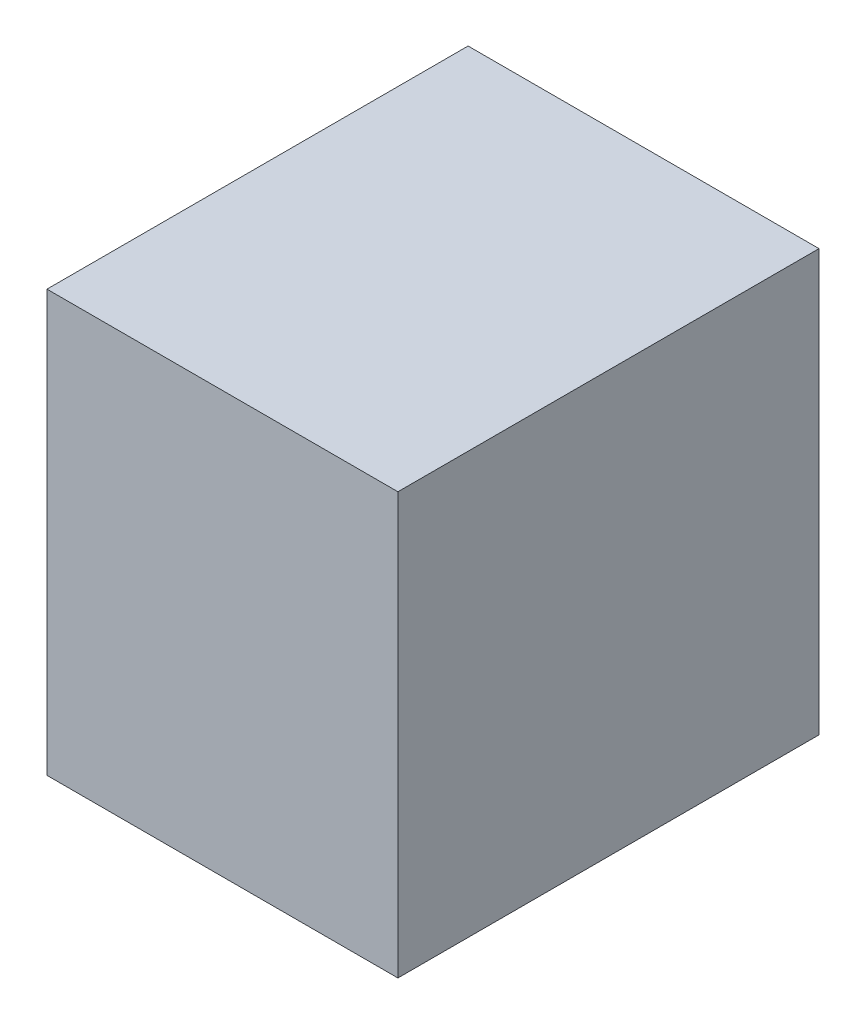
ISO-10303-21;
HEADER;
FILE_DESCRIPTION(('STEP AP214'),'2;1');
FILE_NAME('part.step','',(''),(''),'','','');
FILE_SCHEMA(('AUTOMOTIVE_DESIGN { 1 0 10303 214 1 1 1 1 }'));
ENDSEC;
DATA;
#1=APPLICATION_CONTEXT('core data for automotive mechanical design processes');
#2=APPLICATION_PROTOCOL_DEFINITION('international standard','automotive_design',2000,#1);
#3=PRODUCT_CONTEXT('',#1,'mechanical');
#4=PRODUCT('Part','Part','',(#3));
#5=PRODUCT_RELATED_PRODUCT_CATEGORY('part','',(#4));
#6=PRODUCT_DEFINITION_FORMATION('','',#4);
#7=PRODUCT_DEFINITION_CONTEXT('part definition',#1,'design');
#8=PRODUCT_DEFINITION('design','',#6,#7);
#9=PRODUCT_DEFINITION_SHAPE('','',#8);
#10=(LENGTH_UNIT() NAMED_UNIT(*) SI_UNIT(.MILLI.,.METRE.));
#11=(NAMED_UNIT(*) PLANE_ANGLE_UNIT() SI_UNIT($,.RADIAN.));
#12=(NAMED_UNIT(*) SI_UNIT($,.STERADIAN.) SOLID_ANGLE_UNIT());
#13=UNCERTAINTY_MEASURE_WITH_UNIT(LENGTH_MEASURE(1.E-05),#10,'distance_accuracy_value','');
#14=(GEOMETRIC_REPRESENTATION_CONTEXT(3) GLOBAL_UNCERTAINTY_ASSIGNED_CONTEXT((#13)) GLOBAL_UNIT_ASSIGNED_CONTEXT((#10,
#11,#12)) REPRESENTATION_CONTEXT('',''));
#15=CARTESIAN_POINT('',(0.,0.,0.));
#16=DIRECTION('',(0.,0.,1.));
#17=DIRECTION('',(1.,0.,0.));
#18=AXIS2_PLACEMENT_3D('',#15,#16,#17);
#19=CARTESIAN_POINT('',(44.0503208682354,37.6310916584124,30.));
#20=DIRECTION('',(1.,0.,0.));
#21=DIRECTION('',(0.,0.,-1.));
#22=AXIS2_PLACEMENT_3D('',#19,#20,#21);
#23=PLANE('',#22);
#24=DIRECTION('',(0.,-1.,0.));
#25=VECTOR('',#24,1.);
#26=CARTESIAN_POINT('',(44.0503208682354,37.6310916584124,0.));
#27=LINE('',#26,#25);
#28=CARTESIAN_POINT('',(44.0503208682354,37.6310916584124,0.));
#29=VERTEX_POINT('',#28);
#30=CARTESIAN_POINT('',(44.0503208682354,7.63109165841235,0.));
#31=VERTEX_POINT('',#30);
#32=EDGE_CURVE('E96',#29,#31,#27,.T.);
#33=ORIENTED_EDGE('',*,*,#32,.T.);
#34=DIRECTION('',(0.,0.,-1.));
#35=VECTOR('',#34,1.);
#36=CARTESIAN_POINT('',(44.0503208682354,7.63109165841235,30.));
#37=LINE('',#36,#35);
#38=CARTESIAN_POINT('',(44.0503208682354,7.63109165841235,30.));
#39=VERTEX_POINT('',#38);
#40=EDGE_CURVE('E11',#39,#31,#37,.T.);
#41=ORIENTED_EDGE('',*,*,#40,.F.);
#42=DIRECTION('',(0.,-1.,0.));
#43=VECTOR('',#42,1.);
#44=CARTESIAN_POINT('',(44.0503208682354,37.6310916584124,30.));
#45=LINE('',#44,#43);
#46=CARTESIAN_POINT('',(44.0503208682354,37.6310916584124,30.));
#47=VERTEX_POINT('',#46);
#48=EDGE_CURVE('E84',#47,#39,#45,.T.);
#49=ORIENTED_EDGE('',*,*,#48,.F.);
#50=DIRECTION('',(0.,0.,-1.));
#51=VECTOR('',#50,1.);
#52=CARTESIAN_POINT('',(44.0503208682354,37.6310916584124,30.));
#53=LINE('',#52,#51);
#54=EDGE_CURVE('E92',#47,#29,#53,.T.);
#55=ORIENTED_EDGE('',*,*,#54,.T.);
#56=EDGE_LOOP('',(#33,#41,#49,#55));
#57=FACE_BOUND('',#56,.T.);
#58=ADVANCED_FACE('F33',(#57),#23,.F.);
#59=CARTESIAN_POINT('',(44.0503208682354,7.63109165841235,30.));
#60=DIRECTION('',(0.,1.,0.));
#61=DIRECTION('',(0.,0.,1.));
#62=AXIS2_PLACEMENT_3D('',#59,#60,#61);
#63=PLANE('',#62);
#64=DIRECTION('',(1.,0.,0.));
#65=VECTOR('',#64,1.);
#66=CARTESIAN_POINT('',(44.0503208682354,7.63109165841235,0.));
#67=LINE('',#66,#65);
#68=CARTESIAN_POINT('',(69.0503208682354,7.63109165841235,0.));
#69=VERTEX_POINT('',#68);
#70=EDGE_CURVE('E88',#31,#69,#67,.T.);
#71=ORIENTED_EDGE('',*,*,#70,.T.);
#72=DIRECTION('',(0.,0.,-1.));
#73=VECTOR('',#72,1.);
#74=CARTESIAN_POINT('',(69.0503208682354,7.63109165841235,30.));
#75=LINE('',#74,#73);
#76=CARTESIAN_POINT('',(69.0503208682354,7.63109165841235,30.));
#77=VERTEX_POINT('',#76);
#78=EDGE_CURVE('E41',#77,#69,#75,.T.);
#79=ORIENTED_EDGE('',*,*,#78,.F.);
#80=DIRECTION('',(1.,0.,0.));
#81=VECTOR('',#80,1.);
#82=CARTESIAN_POINT('',(44.0503208682354,7.63109165841235,30.));
#83=LINE('',#82,#81);
#84=EDGE_CURVE('E79',#39,#77,#83,.T.);
#85=ORIENTED_EDGE('',*,*,#84,.F.);
#86=ORIENTED_EDGE('',*,*,#40,.T.);
#87=EDGE_LOOP('',(#71,#79,#85,#86));
#88=FACE_BOUND('',#87,.T.);
#89=ADVANCED_FACE('F87',(#88),#63,.F.);
#90=CARTESIAN_POINT('',(69.0503208682354,37.6310916584124,30.));
#91=DIRECTION('',(-1.,0.,0.));
#92=DIRECTION('',(0.,0.,1.));
#93=AXIS2_PLACEMENT_3D('',#90,#91,#92);
#94=PLANE('',#93);
#95=DIRECTION('',(0.,1.,0.));
#96=VECTOR('',#95,1.);
#97=CARTESIAN_POINT('',(69.0503208682354,37.6310916584124,0.));
#98=LINE('',#97,#96);
#99=CARTESIAN_POINT('',(69.0503208682354,37.6310916584124,0.));
#100=VERTEX_POINT('',#99);
#101=EDGE_CURVE('E66',#69,#100,#98,.T.);
#102=ORIENTED_EDGE('',*,*,#101,.T.);
#103=DIRECTION('',(0.,0.,-1.));
#104=VECTOR('',#103,1.);
#105=CARTESIAN_POINT('',(69.0503208682354,37.6310916584124,30.));
#106=LINE('',#105,#104);
#107=CARTESIAN_POINT('',(69.0503208682354,37.6310916584124,30.));
#108=VERTEX_POINT('',#107);
#109=EDGE_CURVE('E89',#108,#100,#106,.T.);
#110=ORIENTED_EDGE('',*,*,#109,.F.);
#111=DIRECTION('',(0.,1.,0.));
#112=VECTOR('',#111,1.);
#113=CARTESIAN_POINT('',(69.0503208682354,37.6310916584124,30.));
#114=LINE('',#113,#112);
#115=EDGE_CURVE('E82',#77,#108,#114,.T.);
#116=ORIENTED_EDGE('',*,*,#115,.F.);
#117=ORIENTED_EDGE('',*,*,#78,.T.);
#118=EDGE_LOOP('',(#102,#110,#116,#117));
#119=FACE_BOUND('',#118,.T.);
#120=ADVANCED_FACE('F90',(#119),#94,.F.);
#121=CARTESIAN_POINT('',(44.0503208682354,37.6310916584124,30.));
#122=DIRECTION('',(0.,-1.,0.));
#123=DIRECTION('',(0.,0.,-1.));
#124=AXIS2_PLACEMENT_3D('',#121,#122,#123);
#125=PLANE('',#124);
#126=DIRECTION('',(-1.,0.,0.));
#127=VECTOR('',#126,1.);
#128=CARTESIAN_POINT('',(44.0503208682354,37.6310916584124,0.));
#129=LINE('',#128,#127);
#130=EDGE_CURVE('E72',#100,#29,#129,.T.);
#131=ORIENTED_EDGE('',*,*,#130,.T.);
#132=ORIENTED_EDGE('',*,*,#54,.F.);
#133=DIRECTION('',(-1.,0.,0.));
#134=VECTOR('',#133,1.);
#135=CARTESIAN_POINT('',(44.0503208682354,37.6310916584124,30.));
#136=LINE('',#135,#134);
#137=EDGE_CURVE('E49',#108,#47,#136,.T.);
#138=ORIENTED_EDGE('',*,*,#137,.F.);
#139=ORIENTED_EDGE('',*,*,#109,.T.);
#140=EDGE_LOOP('',(#131,#132,#138,#139));
#141=FACE_BOUND('',#140,.T.);
#142=ADVANCED_FACE('F103',(#141),#125,.F.);
#143=CARTESIAN_POINT('',(0.,0.,30.));
#144=DIRECTION('',(0.,0.,1.));
#145=DIRECTION('',(1.,0.,0.));
#146=AXIS2_PLACEMENT_3D('',#143,#144,#145);
#147=PLANE('',#146);
#148=ORIENTED_EDGE('',*,*,#48,.T.);
#149=ORIENTED_EDGE('',*,*,#84,.T.);
#150=ORIENTED_EDGE('',*,*,#115,.T.);
#151=ORIENTED_EDGE('',*,*,#137,.T.);
#152=EDGE_LOOP('',(#148,#149,#150,#151));
#153=FACE_BOUND('',#152,.T.);
#154=ADVANCED_FACE('F80',(#153),#147,.T.);
#155=CARTESIAN_POINT('',(0.,0.,0.));
#156=DIRECTION('',(0.,0.,1.));
#157=DIRECTION('',(1.,0.,0.));
#158=AXIS2_PLACEMENT_3D('',#155,#156,#157);
#159=PLANE('',#158);
#160=ORIENTED_EDGE('',*,*,#32,.F.);
#161=ORIENTED_EDGE('',*,*,#130,.F.);
#162=ORIENTED_EDGE('',*,*,#101,.F.);
#163=ORIENTED_EDGE('',*,*,#70,.F.);
#164=EDGE_LOOP('',(#160,#161,#162,#163));
#165=FACE_BOUND('',#164,.T.);
#166=ADVANCED_FACE('F106',(#165),#159,.F.);
#167=CLOSED_SHELL('',(#58,#89,#120,#142,#154,#166));
#168=MANIFOLD_SOLID_BREP('B2',#167);
#169=ADVANCED_BREP_SHAPE_REPRESENTATION('',(#18,#168),#14);
#170=SHAPE_DEFINITION_REPRESENTATION(#9,#169);
ENDSEC;
END-ISO-10303-21;
